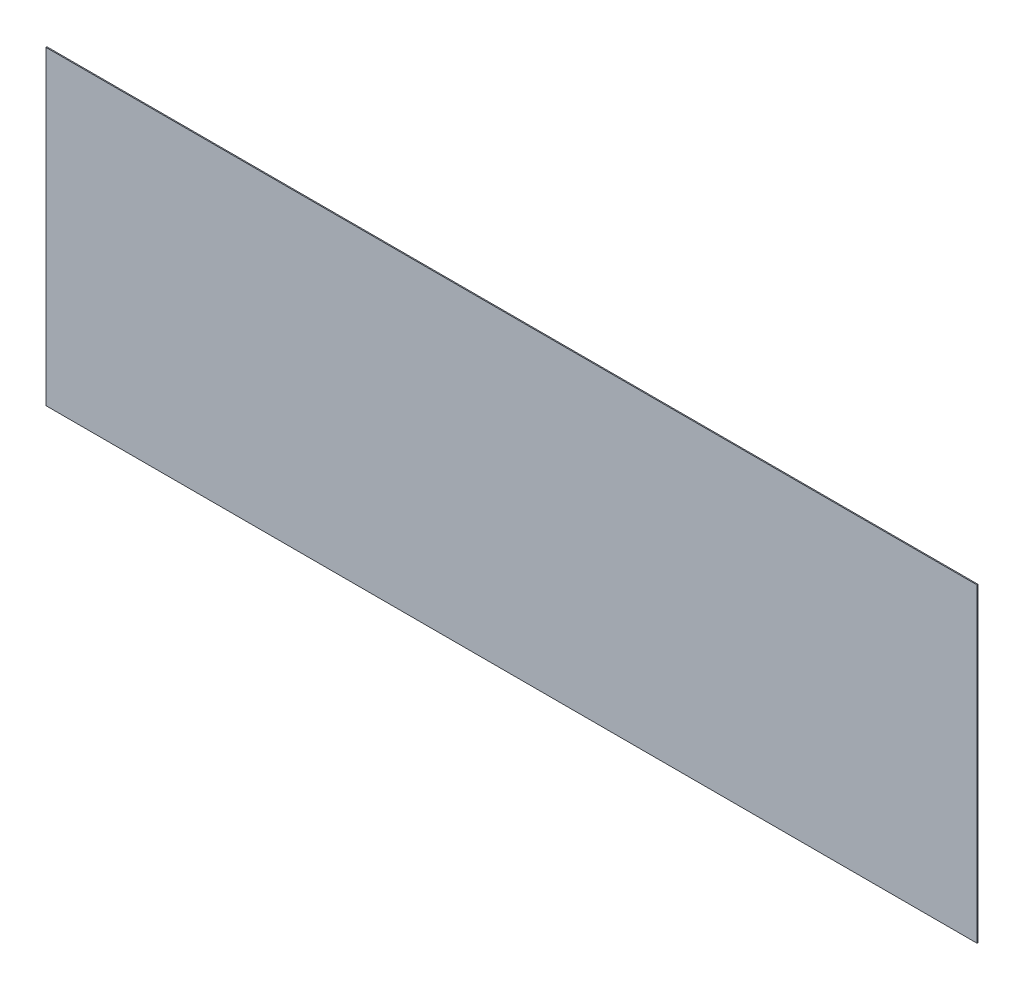
ISO-10303-21;
HEADER;
FILE_DESCRIPTION(('STEP AP214'),'2;1');
FILE_NAME('part.step','',(''),(''),'','','');
FILE_SCHEMA(('AUTOMOTIVE_DESIGN { 1 0 10303 214 1 1 1 1 }'));
ENDSEC;
DATA;
#1=APPLICATION_CONTEXT('core data for automotive mechanical design processes');
#2=APPLICATION_PROTOCOL_DEFINITION('international standard','automotive_design',2000,#1);
#3=PRODUCT_CONTEXT('',#1,'mechanical');
#4=PRODUCT('Part','Part','',(#3));
#5=PRODUCT_RELATED_PRODUCT_CATEGORY('part','',(#4));
#6=PRODUCT_DEFINITION_FORMATION('','',#4);
#7=PRODUCT_DEFINITION_CONTEXT('part definition',#1,'design');
#8=PRODUCT_DEFINITION('design','',#6,#7);
#9=PRODUCT_DEFINITION_SHAPE('','',#8);
#10=(LENGTH_UNIT() NAMED_UNIT(*) SI_UNIT(.MILLI.,.METRE.));
#11=(NAMED_UNIT(*) PLANE_ANGLE_UNIT() SI_UNIT($,.RADIAN.));
#12=(NAMED_UNIT(*) SI_UNIT($,.STERADIAN.) SOLID_ANGLE_UNIT());
#13=UNCERTAINTY_MEASURE_WITH_UNIT(LENGTH_MEASURE(1.E-05),#10,'distance_accuracy_value','');
#14=(GEOMETRIC_REPRESENTATION_CONTEXT(3) GLOBAL_UNCERTAINTY_ASSIGNED_CONTEXT((#13)) GLOBAL_UNIT_ASSIGNED_CONTEXT((#10,
#11,#12)) REPRESENTATION_CONTEXT('',''));
#15=CARTESIAN_POINT('',(0.,0.,0.));
#16=DIRECTION('',(0.,0.,1.));
#17=DIRECTION('',(1.,0.,0.));
#18=AXIS2_PLACEMENT_3D('',#15,#16,#17);
#19=CARTESIAN_POINT('',(-237.,-246.732722436259,0.5));
#20=DIRECTION('',(1.,0.,0.));
#21=DIRECTION('',(0.,1.,0.));
#22=AXIS2_PLACEMENT_3D('',#19,#20,#21);
#23=PLANE('',#22);
#24=DIRECTION('',(0.,-1.,0.));
#25=VECTOR('',#24,1.);
#26=CARTESIAN_POINT('',(-237.,-246.732722436259,0.));
#27=LINE('',#26,#25);
#28=CARTESIAN_POINT('',(-237.,-246.732722436259,0.));
#29=VERTEX_POINT('',#28);
#30=CARTESIAN_POINT('',(-237.,-396.732722436259,0.));
#31=VERTEX_POINT('',#30);
#32=EDGE_CURVE('E98',#29,#31,#27,.T.);
#33=ORIENTED_EDGE('',*,*,#32,.T.);
#34=DIRECTION('',(0.,0.,-1.));
#35=VECTOR('',#34,1.);
#36=CARTESIAN_POINT('',(-237.,-396.732722436259,0.5));
#37=LINE('',#36,#35);
#38=CARTESIAN_POINT('',(-237.,-396.732722436259,0.5));
#39=VERTEX_POINT('',#38);
#40=EDGE_CURVE('E11',#39,#31,#37,.T.);
#41=ORIENTED_EDGE('',*,*,#40,.F.);
#42=DIRECTION('',(0.,-1.,0.));
#43=VECTOR('',#42,1.);
#44=CARTESIAN_POINT('',(-237.,-246.732722436259,0.5));
#45=LINE('',#44,#43);
#46=CARTESIAN_POINT('',(-237.,-246.732722436259,0.5));
#47=VERTEX_POINT('',#46);
#48=EDGE_CURVE('E86',#47,#39,#45,.T.);
#49=ORIENTED_EDGE('',*,*,#48,.F.);
#50=DIRECTION('',(0.,0.,-1.));
#51=VECTOR('',#50,1.);
#52=CARTESIAN_POINT('',(-237.,-246.732722436259,0.5));
#53=LINE('',#52,#51);
#54=EDGE_CURVE('E94',#47,#29,#53,.T.);
#55=ORIENTED_EDGE('',*,*,#54,.T.);
#56=EDGE_LOOP('',(#33,#41,#49,#55));
#57=FACE_BOUND('',#56,.T.);
#58=ADVANCED_FACE('F35',(#57),#23,.F.);
#59=CARTESIAN_POINT('',(-237.,-396.732722436259,0.5));
#60=DIRECTION('',(0.,1.,0.));
#61=DIRECTION('',(0.,0.,1.));
#62=AXIS2_PLACEMENT_3D('',#59,#60,#61);
#63=PLANE('',#62);
#64=DIRECTION('',(1.,0.,0.));
#65=VECTOR('',#64,1.);
#66=CARTESIAN_POINT('',(-237.,-396.732722436259,0.));
#67=LINE('',#66,#65);
#68=CARTESIAN_POINT('',(213.,-396.732722436259,0.));
#69=VERTEX_POINT('',#68);
#70=EDGE_CURVE('E90',#31,#69,#67,.T.);
#71=ORIENTED_EDGE('',*,*,#70,.T.);
#72=DIRECTION('',(0.,0.,-1.));
#73=VECTOR('',#72,1.);
#74=CARTESIAN_POINT('',(213.,-396.732722436259,0.5));
#75=LINE('',#74,#73);
#76=CARTESIAN_POINT('',(213.,-396.732722436259,0.5));
#77=VERTEX_POINT('',#76);
#78=EDGE_CURVE('E43',#77,#69,#75,.T.);
#79=ORIENTED_EDGE('',*,*,#78,.F.);
#80=DIRECTION('',(1.,0.,0.));
#81=VECTOR('',#80,1.);
#82=CARTESIAN_POINT('',(-237.,-396.732722436259,0.5));
#83=LINE('',#82,#81);
#84=EDGE_CURVE('E81',#39,#77,#83,.T.);
#85=ORIENTED_EDGE('',*,*,#84,.F.);
#86=ORIENTED_EDGE('',*,*,#40,.T.);
#87=EDGE_LOOP('',(#71,#79,#85,#86));
#88=FACE_BOUND('',#87,.T.);
#89=ADVANCED_FACE('F89',(#88),#63,.F.);
#90=CARTESIAN_POINT('',(213.,-246.732722436259,0.5));
#91=DIRECTION('',(-1.,0.,0.));
#92=DIRECTION('',(0.,-1.,0.));
#93=AXIS2_PLACEMENT_3D('',#90,#91,#92);
#94=PLANE('',#93);
#95=DIRECTION('',(0.,1.,0.));
#96=VECTOR('',#95,1.);
#97=CARTESIAN_POINT('',(213.,-246.732722436259,0.));
#98=LINE('',#97,#96);
#99=CARTESIAN_POINT('',(213.,-246.732722436259,0.));
#100=VERTEX_POINT('',#99);
#101=EDGE_CURVE('E68',#69,#100,#98,.T.);
#102=ORIENTED_EDGE('',*,*,#101,.T.);
#103=DIRECTION('',(0.,0.,-1.));
#104=VECTOR('',#103,1.);
#105=CARTESIAN_POINT('',(213.,-246.732722436259,0.5));
#106=LINE('',#105,#104);
#107=CARTESIAN_POINT('',(213.,-246.732722436259,0.5));
#108=VERTEX_POINT('',#107);
#109=EDGE_CURVE('E91',#108,#100,#106,.T.);
#110=ORIENTED_EDGE('',*,*,#109,.F.);
#111=DIRECTION('',(0.,1.,0.));
#112=VECTOR('',#111,1.);
#113=CARTESIAN_POINT('',(213.,-246.732722436259,0.5));
#114=LINE('',#113,#112);
#115=EDGE_CURVE('E84',#77,#108,#114,.T.);
#116=ORIENTED_EDGE('',*,*,#115,.F.);
#117=ORIENTED_EDGE('',*,*,#78,.T.);
#118=EDGE_LOOP('',(#102,#110,#116,#117));
#119=FACE_BOUND('',#118,.T.);
#120=ADVANCED_FACE('F92',(#119),#94,.F.);
#121=CARTESIAN_POINT('',(-237.,-246.732722436259,0.5));
#122=DIRECTION('',(0.,-1.,0.));
#123=DIRECTION('',(1.,0.,0.));
#124=AXIS2_PLACEMENT_3D('',#121,#122,#123);
#125=PLANE('',#124);
#126=DIRECTION('',(-1.,0.,0.));
#127=VECTOR('',#126,1.);
#128=CARTESIAN_POINT('',(-237.,-246.732722436259,0.));
#129=LINE('',#128,#127);
#130=EDGE_CURVE('E74',#100,#29,#129,.T.);
#131=ORIENTED_EDGE('',*,*,#130,.T.);
#132=ORIENTED_EDGE('',*,*,#54,.F.);
#133=DIRECTION('',(-1.,0.,0.));
#134=VECTOR('',#133,1.);
#135=CARTESIAN_POINT('',(-237.,-246.732722436259,0.5));
#136=LINE('',#135,#134);
#137=EDGE_CURVE('E51',#108,#47,#136,.T.);
#138=ORIENTED_EDGE('',*,*,#137,.F.);
#139=ORIENTED_EDGE('',*,*,#109,.T.);
#140=EDGE_LOOP('',(#131,#132,#138,#139));
#141=FACE_BOUND('',#140,.T.);
#142=ADVANCED_FACE('F105',(#141),#125,.F.);
#143=CARTESIAN_POINT('',(0.,0.,0.5));
#144=DIRECTION('',(0.,0.,1.));
#145=DIRECTION('',(1.,0.,0.));
#146=AXIS2_PLACEMENT_3D('',#143,#144,#145);
#147=PLANE('',#146);
#148=ORIENTED_EDGE('',*,*,#48,.T.);
#149=ORIENTED_EDGE('',*,*,#84,.T.);
#150=ORIENTED_EDGE('',*,*,#115,.T.);
#151=ORIENTED_EDGE('',*,*,#137,.T.);
#152=EDGE_LOOP('',(#148,#149,#150,#151));
#153=FACE_BOUND('',#152,.T.);
#154=ADVANCED_FACE('F82',(#153),#147,.T.);
#155=CARTESIAN_POINT('',(0.,0.,0.));
#156=DIRECTION('',(0.,0.,1.));
#157=DIRECTION('',(1.,0.,0.));
#158=AXIS2_PLACEMENT_3D('',#155,#156,#157);
#159=PLANE('',#158);
#160=ORIENTED_EDGE('',*,*,#32,.F.);
#161=ORIENTED_EDGE('',*,*,#130,.F.);
#162=ORIENTED_EDGE('',*,*,#101,.F.);
#163=ORIENTED_EDGE('',*,*,#70,.F.);
#164=EDGE_LOOP('',(#160,#161,#162,#163));
#165=FACE_BOUND('',#164,.T.);
#166=ADVANCED_FACE('F108',(#165),#159,.F.);
#167=CLOSED_SHELL('',(#58,#89,#120,#142,#154,#166));
#168=MANIFOLD_SOLID_BREP('B2',#167);
#169=ADVANCED_BREP_SHAPE_REPRESENTATION('',(#18,#168),#14);
#170=SHAPE_DEFINITION_REPRESENTATION(#9,#169);
ENDSEC;
END-ISO-10303-21;
